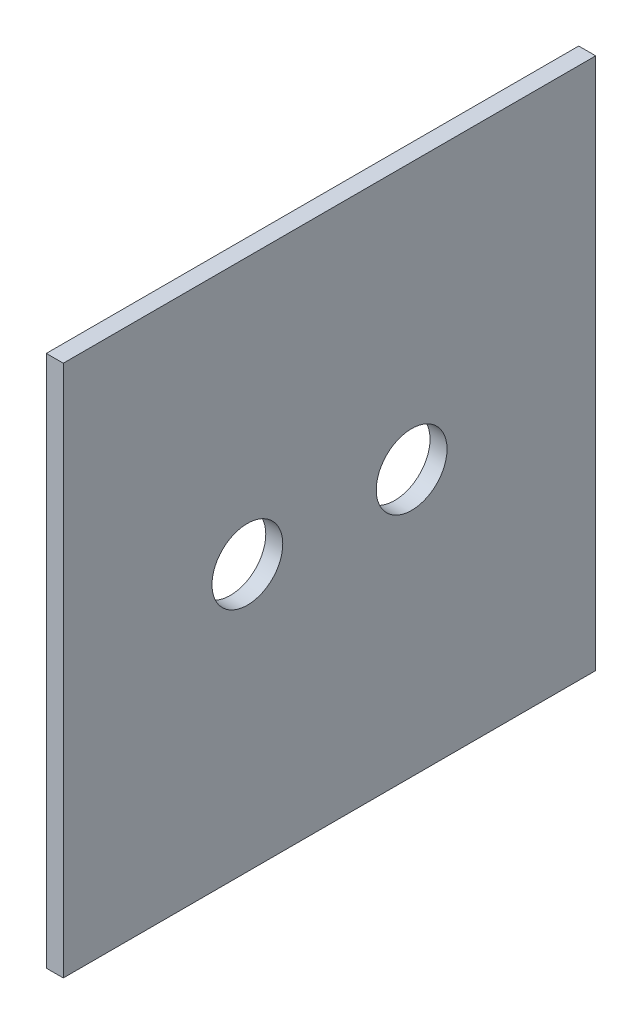
ISO-10303-21;
HEADER;
FILE_DESCRIPTION(('STEP AP214'),'2;1');
FILE_NAME('part.step','',(''),(''),'','','');
FILE_SCHEMA(('AUTOMOTIVE_DESIGN { 1 0 10303 214 1 1 1 1 }'));
ENDSEC;
DATA;
#1=APPLICATION_CONTEXT('core data for automotive mechanical design processes');
#2=APPLICATION_PROTOCOL_DEFINITION('international standard','automotive_design',2000,#1);
#3=PRODUCT_CONTEXT('',#1,'mechanical');
#4=PRODUCT('Part','Part','',(#3));
#5=PRODUCT_RELATED_PRODUCT_CATEGORY('part','',(#4));
#6=PRODUCT_DEFINITION_FORMATION('','',#4);
#7=PRODUCT_DEFINITION_CONTEXT('part definition',#1,'design');
#8=PRODUCT_DEFINITION('design','',#6,#7);
#9=PRODUCT_DEFINITION_SHAPE('','',#8);
#10=(LENGTH_UNIT() NAMED_UNIT(*) SI_UNIT(.MILLI.,.METRE.));
#11=(NAMED_UNIT(*) PLANE_ANGLE_UNIT() SI_UNIT($,.RADIAN.));
#12=(NAMED_UNIT(*) SI_UNIT($,.STERADIAN.) SOLID_ANGLE_UNIT());
#13=UNCERTAINTY_MEASURE_WITH_UNIT(LENGTH_MEASURE(1.E-05),#10,'distance_accuracy_value','');
#14=(GEOMETRIC_REPRESENTATION_CONTEXT(3) GLOBAL_UNCERTAINTY_ASSIGNED_CONTEXT((#13)) GLOBAL_UNIT_ASSIGNED_CONTEXT((#10,
#11,#12)) REPRESENTATION_CONTEXT('',''));
#15=CARTESIAN_POINT('',(0.,0.,0.));
#16=DIRECTION('',(0.,0.,1.));
#17=DIRECTION('',(1.,0.,0.));
#18=AXIS2_PLACEMENT_3D('',#15,#16,#17);
#19=CARTESIAN_POINT('',(6.,0.,0.));
#20=DIRECTION('',(1.,0.,0.));
#21=DIRECTION('',(0.,0.,-1.));
#22=AXIS2_PLACEMENT_3D('',#19,#20,#21);
#23=PLANE('',#22);
#24=CARTESIAN_POINT('',(6.,27.4592391304348,-42.2826086956521));
#25=DIRECTION('',(1.,0.,0.));
#26=DIRECTION('',(0.,0.,-1.));
#27=AXIS2_PLACEMENT_3D('',#24,#25,#26);
#28=CIRCLE('',#27,12.5);
#29=CARTESIAN_POINT('',(6.,27.4592391304348,-54.7826086956521));
#30=VERTEX_POINT('',#29);
#31=EDGE_CURVE('E100',#30,#30,#28,.T.);
#32=ORIENTED_EDGE('',*,*,#31,.F.);
#33=EDGE_LOOP('',(#32));
#34=FACE_BOUND('',#33,.T.);
#35=DIRECTION('',(0.,-1.,0.));
#36=VECTOR('',#35,1.);
#37=CARTESIAN_POINT('',(6.,121.459239130435,80.7173913043479));
#38=LINE('',#37,#36);
#39=CARTESIAN_POINT('',(6.,121.459239130435,80.7173913043479));
#40=VERTEX_POINT('',#39);
#41=CARTESIAN_POINT('',(6.,-66.5407608695652,80.7173913043478));
#42=VERTEX_POINT('',#41);
#43=EDGE_CURVE('E85',#40,#42,#38,.T.);
#44=ORIENTED_EDGE('',*,*,#43,.T.);
#45=DIRECTION('',(0.,0.,-1.));
#46=VECTOR('',#45,1.);
#47=CARTESIAN_POINT('',(6.,-66.5407608695652,80.7173913043478));
#48=LINE('',#47,#46);
#49=CARTESIAN_POINT('',(6.,-66.5407608695652,-107.282608695652));
#50=VERTEX_POINT('',#49);
#51=EDGE_CURVE('E80',#42,#50,#48,.T.);
#52=ORIENTED_EDGE('',*,*,#51,.T.);
#53=DIRECTION('',(0.,1.,0.));
#54=VECTOR('',#53,1.);
#55=CARTESIAN_POINT('',(6.,121.459239130435,-107.282608695652));
#56=LINE('',#55,#54);
#57=CARTESIAN_POINT('',(6.,121.459239130435,-107.282608695652));
#58=VERTEX_POINT('',#57);
#59=EDGE_CURVE('E83',#50,#58,#56,.T.);
#60=ORIENTED_EDGE('',*,*,#59,.T.);
#61=DIRECTION('',(0.,0.,1.));
#62=VECTOR('',#61,1.);
#63=CARTESIAN_POINT('',(6.,121.459239130435,80.7173913043479));
#64=LINE('',#63,#62);
#65=EDGE_CURVE('E50',#58,#40,#64,.T.);
#66=ORIENTED_EDGE('',*,*,#65,.T.);
#67=EDGE_LOOP('',(#44,#52,#60,#66));
#68=FACE_BOUND('',#67,.T.);
#69=CARTESIAN_POINT('',(6.,27.4592391304348,15.7173913043479));
#70=DIRECTION('',(1.,0.,0.));
#71=DIRECTION('',(0.,0.,-1.));
#72=AXIS2_PLACEMENT_3D('',#69,#70,#71);
#73=CIRCLE('',#72,12.5);
#74=CARTESIAN_POINT('',(6.,27.4592391304348,3.21739130434788));
#75=VERTEX_POINT('',#74);
#76=EDGE_CURVE('E115',#75,#75,#73,.T.);
#77=ORIENTED_EDGE('',*,*,#76,.F.);
#78=EDGE_LOOP('',(#77));
#79=FACE_BOUND('',#78,.T.);
#80=ADVANCED_FACE('F33',(#34,#68,#79),#23,.T.);
#81=CARTESIAN_POINT('',(0.,0.,0.));
#82=DIRECTION('',(1.,0.,0.));
#83=DIRECTION('',(0.,0.,-1.));
#84=AXIS2_PLACEMENT_3D('',#81,#82,#83);
#85=PLANE('',#84);
#86=DIRECTION('',(0.,-1.,0.));
#87=VECTOR('',#86,1.);
#88=CARTESIAN_POINT('',(0.,121.459239130435,80.7173913043479));
#89=LINE('',#88,#87);
#90=CARTESIAN_POINT('',(0.,121.459239130435,80.7173913043479));
#91=VERTEX_POINT('',#90);
#92=CARTESIAN_POINT('',(0.,-66.5407608695652,80.7173913043478));
#93=VERTEX_POINT('',#92);
#94=EDGE_CURVE('E97',#91,#93,#89,.T.);
#95=ORIENTED_EDGE('',*,*,#94,.F.);
#96=DIRECTION('',(0.,0.,1.));
#97=VECTOR('',#96,1.);
#98=CARTESIAN_POINT('',(0.,121.459239130435,80.7173913043479));
#99=LINE('',#98,#97);
#100=CARTESIAN_POINT('',(0.,121.459239130435,-107.282608695652));
#101=VERTEX_POINT('',#100);
#102=EDGE_CURVE('E73',#101,#91,#99,.T.);
#103=ORIENTED_EDGE('',*,*,#102,.F.);
#104=DIRECTION('',(0.,1.,0.));
#105=VECTOR('',#104,1.);
#106=CARTESIAN_POINT('',(0.,121.459239130435,-107.282608695652));
#107=LINE('',#106,#105);
#108=CARTESIAN_POINT('',(0.,-66.5407608695652,-107.282608695652));
#109=VERTEX_POINT('',#108);
#110=EDGE_CURVE('E67',#109,#101,#107,.T.);
#111=ORIENTED_EDGE('',*,*,#110,.F.);
#112=DIRECTION('',(0.,0.,-1.));
#113=VECTOR('',#112,1.);
#114=CARTESIAN_POINT('',(0.,-66.5407608695652,80.7173913043478));
#115=LINE('',#114,#113);
#116=EDGE_CURVE('E89',#93,#109,#115,.T.);
#117=ORIENTED_EDGE('',*,*,#116,.F.);
#118=EDGE_LOOP('',(#95,#103,#111,#117));
#119=FACE_BOUND('',#118,.T.);
#120=CARTESIAN_POINT('',(0.,27.4592391304348,-42.2826086956521));
#121=DIRECTION('',(1.,0.,0.));
#122=DIRECTION('',(0.,0.,-1.));
#123=AXIS2_PLACEMENT_3D('',#120,#121,#122);
#124=CIRCLE('',#123,12.5);
#125=CARTESIAN_POINT('',(0.,27.4592391304348,-54.7826086956521));
#126=VERTEX_POINT('',#125);
#127=EDGE_CURVE('E112',#126,#126,#124,.T.);
#128=ORIENTED_EDGE('',*,*,#127,.T.);
#129=EDGE_LOOP('',(#128));
#130=FACE_BOUND('',#129,.T.);
#131=CARTESIAN_POINT('',(0.,27.4592391304348,15.7173913043479));
#132=DIRECTION('',(1.,0.,0.));
#133=DIRECTION('',(0.,0.,-1.));
#134=AXIS2_PLACEMENT_3D('',#131,#132,#133);
#135=CIRCLE('',#134,12.5);
#136=CARTESIAN_POINT('',(0.,27.4592391304348,3.21739130434788));
#137=VERTEX_POINT('',#136);
#138=EDGE_CURVE('E118',#137,#137,#135,.T.);
#139=ORIENTED_EDGE('',*,*,#138,.T.);
#140=EDGE_LOOP('',(#139));
#141=FACE_BOUND('',#140,.T.);
#142=ADVANCED_FACE('F108',(#119,#130,#141),#85,.F.);
#143=CARTESIAN_POINT('',(6.,121.459239130435,80.7173913043479));
#144=DIRECTION('',(0.,0.,-1.));
#145=DIRECTION('',(0.,1.,0.));
#146=AXIS2_PLACEMENT_3D('',#143,#144,#145);
#147=PLANE('',#146);
#148=ORIENTED_EDGE('',*,*,#94,.T.);
#149=DIRECTION('',(-1.,0.,0.));
#150=VECTOR('',#149,1.);
#151=CARTESIAN_POINT('',(6.,-66.5407608695652,80.7173913043478));
#152=LINE('',#151,#150);
#153=EDGE_CURVE('E11',#42,#93,#152,.T.);
#154=ORIENTED_EDGE('',*,*,#153,.F.);
#155=ORIENTED_EDGE('',*,*,#43,.F.);
#156=DIRECTION('',(-1.,0.,0.));
#157=VECTOR('',#156,1.);
#158=CARTESIAN_POINT('',(6.,121.459239130435,80.7173913043479));
#159=LINE('',#158,#157);
#160=EDGE_CURVE('E93',#40,#91,#159,.T.);
#161=ORIENTED_EDGE('',*,*,#160,.T.);
#162=EDGE_LOOP('',(#148,#154,#155,#161));
#163=FACE_BOUND('',#162,.T.);
#164=ADVANCED_FACE('F35',(#163),#147,.F.);
#165=CARTESIAN_POINT('',(6.,-66.5407608695652,80.7173913043478));
#166=DIRECTION('',(0.,1.,0.));
#167=DIRECTION('',(0.,0.,1.));
#168=AXIS2_PLACEMENT_3D('',#165,#166,#167);
#169=PLANE('',#168);
#170=ORIENTED_EDGE('',*,*,#116,.T.);
#171=DIRECTION('',(-1.,0.,0.));
#172=VECTOR('',#171,1.);
#173=CARTESIAN_POINT('',(6.,-66.5407608695652,-107.282608695652));
#174=LINE('',#173,#172);
#175=EDGE_CURVE('E42',#50,#109,#174,.T.);
#176=ORIENTED_EDGE('',*,*,#175,.F.);
#177=ORIENTED_EDGE('',*,*,#51,.F.);
#178=ORIENTED_EDGE('',*,*,#153,.T.);
#179=EDGE_LOOP('',(#170,#176,#177,#178));
#180=FACE_BOUND('',#179,.T.);
#181=ADVANCED_FACE('F88',(#180),#169,.F.);
#182=CARTESIAN_POINT('',(6.,121.459239130435,-107.282608695652));
#183=DIRECTION('',(0.,0.,1.));
#184=DIRECTION('',(0.,-1.,0.));
#185=AXIS2_PLACEMENT_3D('',#182,#183,#184);
#186=PLANE('',#185);
#187=ORIENTED_EDGE('',*,*,#110,.T.);
#188=DIRECTION('',(-1.,0.,0.));
#189=VECTOR('',#188,1.);
#190=CARTESIAN_POINT('',(6.,121.459239130435,-107.282608695652));
#191=LINE('',#190,#189);
#192=EDGE_CURVE('E90',#58,#101,#191,.T.);
#193=ORIENTED_EDGE('',*,*,#192,.F.);
#194=ORIENTED_EDGE('',*,*,#59,.F.);
#195=ORIENTED_EDGE('',*,*,#175,.T.);
#196=EDGE_LOOP('',(#187,#193,#194,#195));
#197=FACE_BOUND('',#196,.T.);
#198=ADVANCED_FACE('F91',(#197),#186,.F.);
#199=CARTESIAN_POINT('',(6.,121.459239130435,80.7173913043479));
#200=DIRECTION('',(0.,-1.,0.));
#201=DIRECTION('',(0.,0.,-1.));
#202=AXIS2_PLACEMENT_3D('',#199,#200,#201);
#203=PLANE('',#202);
#204=ORIENTED_EDGE('',*,*,#102,.T.);
#205=ORIENTED_EDGE('',*,*,#160,.F.);
#206=ORIENTED_EDGE('',*,*,#65,.F.);
#207=ORIENTED_EDGE('',*,*,#192,.T.);
#208=EDGE_LOOP('',(#204,#205,#206,#207));
#209=FACE_BOUND('',#208,.T.);
#210=ADVANCED_FACE('F105',(#209),#203,.F.);
#211=CARTESIAN_POINT('',(6.,27.4592391304348,-42.2826086956521));
#212=DIRECTION('',(-1.,0.,0.));
#213=DIRECTION('',(0.,0.,1.));
#214=AXIS2_PLACEMENT_3D('',#211,#212,#213);
#215=CYLINDRICAL_SURFACE('',#214,12.5);
#216=ORIENTED_EDGE('',*,*,#31,.T.);
#217=EDGE_LOOP('',(#216));
#218=FACE_BOUND('',#217,.T.);
#219=ORIENTED_EDGE('',*,*,#127,.F.);
#220=EDGE_LOOP('',(#219));
#221=FACE_BOUND('',#220,.T.);
#222=ADVANCED_FACE('F135',(#218,#221),#215,.F.);
#223=CARTESIAN_POINT('',(6.,27.4592391304348,15.7173913043479));
#224=DIRECTION('',(-1.,0.,0.));
#225=DIRECTION('',(0.,0.,1.));
#226=AXIS2_PLACEMENT_3D('',#223,#224,#225);
#227=CYLINDRICAL_SURFACE('',#226,12.5);
#228=ORIENTED_EDGE('',*,*,#76,.T.);
#229=EDGE_LOOP('',(#228));
#230=FACE_BOUND('',#229,.T.);
#231=ORIENTED_EDGE('',*,*,#138,.F.);
#232=EDGE_LOOP('',(#231));
#233=FACE_BOUND('',#232,.T.);
#234=ADVANCED_FACE('F124',(#230,#233),#227,.F.);
#235=CLOSED_SHELL('',(#80,#142,#164,#181,#198,#210,#222,#234));
#236=MANIFOLD_SOLID_BREP('B2',#235);
#237=ADVANCED_BREP_SHAPE_REPRESENTATION('',(#18,#236),#14);
#238=SHAPE_DEFINITION_REPRESENTATION(#9,#237);
ENDSEC;
END-ISO-10303-21;
